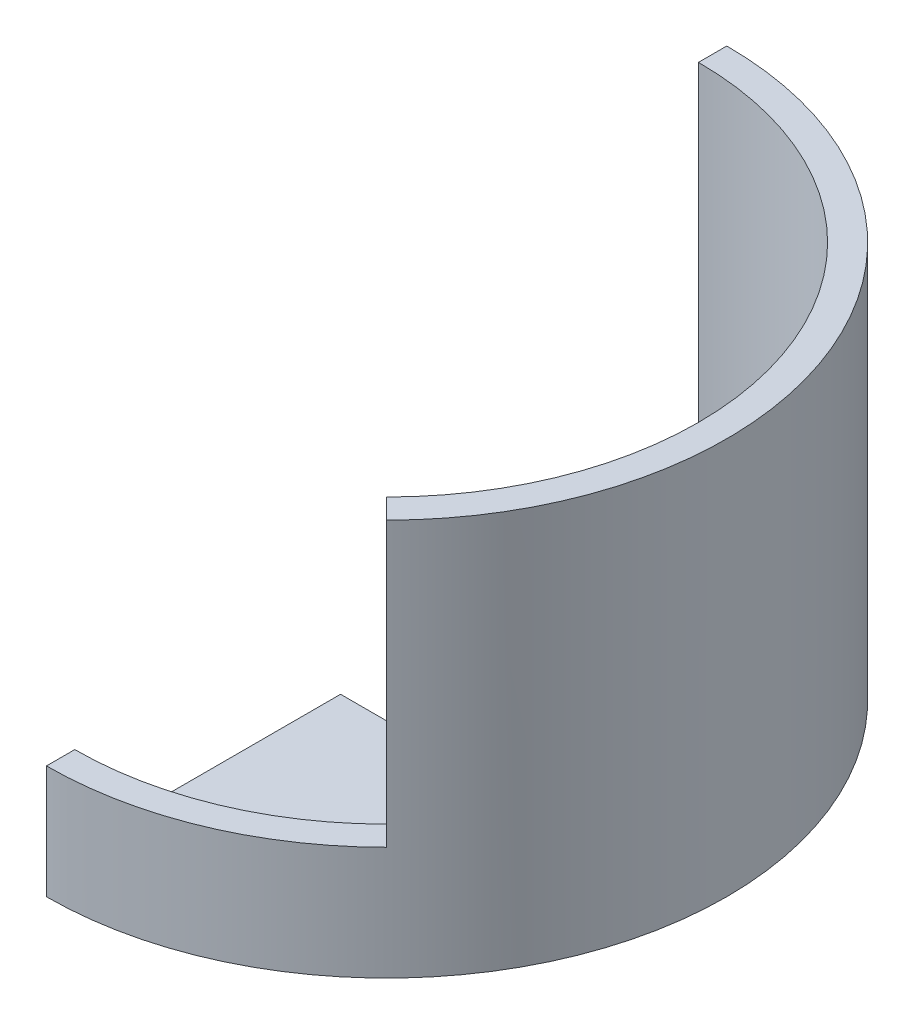
ISO-10303-21;
HEADER;
FILE_DESCRIPTION(('STEP AP214'),'2;1');
FILE_NAME('part.step','',(''),(''),'','','');
FILE_SCHEMA(('AUTOMOTIVE_DESIGN { 1 0 10303 214 1 1 1 1 }'));
ENDSEC;
DATA;
#1=APPLICATION_CONTEXT('core data for automotive mechanical design processes');
#2=APPLICATION_PROTOCOL_DEFINITION('international standard','automotive_design',2000,#1);
#3=PRODUCT_CONTEXT('',#1,'mechanical');
#4=PRODUCT('Part','Part','',(#3));
#5=PRODUCT_RELATED_PRODUCT_CATEGORY('part','',(#4));
#6=PRODUCT_DEFINITION_FORMATION('','',#4);
#7=PRODUCT_DEFINITION_CONTEXT('part definition',#1,'design');
#8=PRODUCT_DEFINITION('design','',#6,#7);
#9=PRODUCT_DEFINITION_SHAPE('','',#8);
#10=(LENGTH_UNIT() NAMED_UNIT(*) SI_UNIT(.MILLI.,.METRE.));
#11=(NAMED_UNIT(*) PLANE_ANGLE_UNIT() SI_UNIT($,.RADIAN.));
#12=(NAMED_UNIT(*) SI_UNIT($,.STERADIAN.) SOLID_ANGLE_UNIT());
#13=UNCERTAINTY_MEASURE_WITH_UNIT(LENGTH_MEASURE(1.E-05),#10,'distance_accuracy_value','');
#14=(GEOMETRIC_REPRESENTATION_CONTEXT(3) GLOBAL_UNCERTAINTY_ASSIGNED_CONTEXT((#13)) GLOBAL_UNIT_ASSIGNED_CONTEXT((#10,
#11,#12)) REPRESENTATION_CONTEXT('',''));
#15=CARTESIAN_POINT('',(0.,0.,0.));
#16=DIRECTION('',(0.,0.,1.));
#17=DIRECTION('',(1.,0.,0.));
#18=AXIS2_PLACEMENT_3D('',#15,#16,#17);
#19=CARTESIAN_POINT('',(0.,0.,0.));
#20=DIRECTION('',(1.,0.,0.));
#21=DIRECTION('',(0.,0.,-1.));
#22=AXIS2_PLACEMENT_3D('',#19,#20,#21);
#23=PLANE('',#22);
#24=DIRECTION('',(0.,0.,-1.));
#25=VECTOR('',#24,1.);
#26=CARTESIAN_POINT('',(0.,0.,0.));
#27=LINE('',#26,#25);
#28=CARTESIAN_POINT('',(0.,0.,-20.6375));
#29=VERTEX_POINT('',#28);
#30=CARTESIAN_POINT('',(0.,0.,-139.7));
#31=VERTEX_POINT('',#30);
#32=EDGE_CURVE('E146',#29,#31,#27,.T.);
#33=ORIENTED_EDGE('',*,*,#32,.F.);
#34=DIRECTION('',(0.,-1.,0.));
#35=VECTOR('',#34,1.);
#36=CARTESIAN_POINT('',(0.,12.7,-20.6375));
#37=LINE('',#36,#35);
#38=CARTESIAN_POINT('',(0.,12.7,-20.6375));
#39=VERTEX_POINT('',#38);
#40=EDGE_CURVE('E142',#39,#29,#37,.T.);
#41=ORIENTED_EDGE('',*,*,#40,.F.);
#42=DIRECTION('',(0.,0.,-1.));
#43=VECTOR('',#42,1.);
#44=CARTESIAN_POINT('',(0.,12.7,0.));
#45=LINE('',#44,#43);
#46=CARTESIAN_POINT('',(0.,12.7,-139.7));
#47=VERTEX_POINT('',#46);
#48=EDGE_CURVE('E62',#39,#47,#45,.T.);
#49=ORIENTED_EDGE('',*,*,#48,.T.);
#50=DIRECTION('',(0.,-1.,0.));
#51=VECTOR('',#50,1.);
#52=CARTESIAN_POINT('',(0.,12.7,-139.7));
#53=LINE('',#52,#51);
#54=EDGE_CURVE('E57',#31,#47,#53,.F.);
#55=ORIENTED_EDGE('',*,*,#54,.F.);
#56=EDGE_LOOP('',(#33,#41,#49,#55));
#57=FACE_BOUND('',#56,.T.);
#58=ADVANCED_FACE('F54',(#57),#23,.F.);
#59=CARTESIAN_POINT('',(0.,12.7,139.7));
#60=VERTEX_POINT('',#59);
#61=CARTESIAN_POINT('',(0.,12.7,20.6375));
#62=VERTEX_POINT('',#61);
#63=EDGE_CURVE('E148',#60,#62,#45,.T.);
#64=ORIENTED_EDGE('',*,*,#63,.T.);
#65=DIRECTION('',(0.,-1.,0.));
#66=VECTOR('',#65,1.);
#67=CARTESIAN_POINT('',(0.,12.7,20.6375));
#68=LINE('',#67,#66);
#69=CARTESIAN_POINT('',(0.,0.,20.6375));
#70=VERTEX_POINT('',#69);
#71=EDGE_CURVE('E12',#62,#70,#68,.T.);
#72=ORIENTED_EDGE('',*,*,#71,.T.);
#73=CARTESIAN_POINT('',(0.,0.,139.7));
#74=VERTEX_POINT('',#73);
#75=EDGE_CURVE('E70',#74,#70,#27,.T.);
#76=ORIENTED_EDGE('',*,*,#75,.F.);
#77=DIRECTION('',(0.,-1.,0.));
#78=VECTOR('',#77,1.);
#79=CARTESIAN_POINT('',(0.,12.7,139.7));
#80=LINE('',#79,#78);
#81=EDGE_CURVE('E149',#60,#74,#80,.T.);
#82=ORIENTED_EDGE('',*,*,#81,.F.);
#83=EDGE_LOOP('',(#64,#72,#76,#82));
#84=FACE_BOUND('',#83,.T.);
#85=ADVANCED_FACE('F158',(#84),#23,.F.);
#86=CARTESIAN_POINT('',(0.,12.7,0.));
#87=DIRECTION('',(0.,-1.,0.));
#88=DIRECTION('',(0.,0.,-1.));
#89=AXIS2_PLACEMENT_3D('',#86,#87,#88);
#90=CYLINDRICAL_SURFACE('',#89,139.7);
#91=CARTESIAN_POINT('',(0.,12.7,0.));
#92=DIRECTION('',(0.,1.,0.));
#93=DIRECTION('',(0.,0.,1.));
#94=AXIS2_PLACEMENT_3D('',#91,#92,#93);
#95=CIRCLE('',#94,139.7);
#96=EDGE_CURVE('E140',#60,#47,#95,.T.);
#97=ORIENTED_EDGE('',*,*,#96,.F.);
#98=ORIENTED_EDGE('',*,*,#81,.T.);
#99=CARTESIAN_POINT('',(0.,0.,0.));
#100=DIRECTION('',(0.,1.,0.));
#101=DIRECTION('',(0.,0.,1.));
#102=AXIS2_PLACEMENT_3D('',#99,#100,#101);
#103=CIRCLE('',#102,139.7);
#104=EDGE_CURVE('E135',#74,#31,#103,.T.);
#105=ORIENTED_EDGE('',*,*,#104,.T.);
#106=ORIENTED_EDGE('',*,*,#54,.T.);
#107=EDGE_LOOP('',(#97,#98,#105,#106));
#108=FACE_BOUND('',#107,.T.);
#109=ADVANCED_FACE('F156',(#108),#90,.T.);
#110=CARTESIAN_POINT('',(0.,12.7,0.));
#111=DIRECTION('',(0.,1.,0.));
#112=DIRECTION('',(0.,0.,1.));
#113=AXIS2_PLACEMENT_3D('',#110,#111,#112);
#114=PLANE('',#113);
#115=ORIENTED_EDGE('',*,*,#63,.F.);
#116=ORIENTED_EDGE('',*,*,#96,.T.);
#117=ORIENTED_EDGE('',*,*,#48,.F.);
#118=DIRECTION('',(1.,0.,0.));
#119=VECTOR('',#118,1.);
#120=CARTESIAN_POINT('',(-20.6375,12.7,-20.6375));
#121=LINE('',#120,#119);
#122=CARTESIAN_POINT('',(20.6375,12.7,-20.6375));
#123=VERTEX_POINT('',#122);
#124=EDGE_CURVE('E107',#39,#123,#121,.T.);
#125=ORIENTED_EDGE('',*,*,#124,.T.);
#126=DIRECTION('',(0.,0.,-1.));
#127=VECTOR('',#126,1.);
#128=CARTESIAN_POINT('',(20.6375,12.7,20.6375));
#129=LINE('',#128,#127);
#130=CARTESIAN_POINT('',(20.6375,12.7,20.6375));
#131=VERTEX_POINT('',#130);
#132=EDGE_CURVE('E112',#131,#123,#129,.T.);
#133=ORIENTED_EDGE('',*,*,#132,.F.);
#134=DIRECTION('',(1.,0.,0.));
#135=VECTOR('',#134,1.);
#136=CARTESIAN_POINT('',(-20.6375,12.7,20.6375));
#137=LINE('',#136,#135);
#138=EDGE_CURVE('E129',#62,#131,#137,.T.);
#139=ORIENTED_EDGE('',*,*,#138,.F.);
#140=EDGE_LOOP('',(#115,#116,#117,#125,#133,#139));
#141=FACE_BOUND('',#140,.T.);
#142=ADVANCED_FACE('F110',(#141),#114,.T.);
#143=CARTESIAN_POINT('',(0.,0.,0.));
#144=DIRECTION('',(0.,1.,0.));
#145=DIRECTION('',(0.,0.,1.));
#146=AXIS2_PLACEMENT_3D('',#143,#144,#145);
#147=PLANE('',#146);
#148=ORIENTED_EDGE('',*,*,#104,.F.);
#149=ORIENTED_EDGE('',*,*,#75,.T.);
#150=DIRECTION('',(1.,0.,0.));
#151=VECTOR('',#150,1.);
#152=CARTESIAN_POINT('',(-20.6375,0.,20.6375));
#153=LINE('',#152,#151);
#154=CARTESIAN_POINT('',(20.6375,0.,20.6375));
#155=VERTEX_POINT('',#154);
#156=EDGE_CURVE('E118',#70,#155,#153,.T.);
#157=ORIENTED_EDGE('',*,*,#156,.T.);
#158=DIRECTION('',(0.,0.,-1.));
#159=VECTOR('',#158,1.);
#160=CARTESIAN_POINT('',(20.6375,0.,20.6375));
#161=LINE('',#160,#159);
#162=CARTESIAN_POINT('',(20.6375,0.,-20.6375));
#163=VERTEX_POINT('',#162);
#164=EDGE_CURVE('E160',#155,#163,#161,.T.);
#165=ORIENTED_EDGE('',*,*,#164,.T.);
#166=DIRECTION('',(1.,0.,0.));
#167=VECTOR('',#166,1.);
#168=CARTESIAN_POINT('',(-20.6375,0.,-20.6375));
#169=LINE('',#168,#167);
#170=EDGE_CURVE('E133',#29,#163,#169,.T.);
#171=ORIENTED_EDGE('',*,*,#170,.F.);
#172=ORIENTED_EDGE('',*,*,#32,.T.);
#173=EDGE_LOOP('',(#148,#149,#157,#165,#171,#172));
#174=FACE_BOUND('',#173,.T.);
#175=ADVANCED_FACE('F152',(#174),#147,.F.);
#176=CARTESIAN_POINT('',(-20.6375,12.7,-20.6375));
#177=DIRECTION('',(0.,0.,-1.));
#178=DIRECTION('',(-1.,0.,0.));
#179=AXIS2_PLACEMENT_3D('',#176,#177,#178);
#180=PLANE('',#179);
#181=ORIENTED_EDGE('',*,*,#124,.F.);
#182=ORIENTED_EDGE('',*,*,#40,.T.);
#183=ORIENTED_EDGE('',*,*,#170,.T.);
#184=DIRECTION('',(0.,-1.,0.));
#185=VECTOR('',#184,1.);
#186=CARTESIAN_POINT('',(20.6375,12.7,-20.6375));
#187=LINE('',#186,#185);
#188=EDGE_CURVE('E125',#123,#163,#187,.T.);
#189=ORIENTED_EDGE('',*,*,#188,.F.);
#190=EDGE_LOOP('',(#181,#182,#183,#189));
#191=FACE_BOUND('',#190,.T.);
#192=ADVANCED_FACE('F131',(#191),#180,.F.);
#193=CARTESIAN_POINT('',(-20.6375,12.7,20.6375));
#194=DIRECTION('',(0.,0.,-1.));
#195=DIRECTION('',(-1.,0.,0.));
#196=AXIS2_PLACEMENT_3D('',#193,#194,#195);
#197=PLANE('',#196);
#198=ORIENTED_EDGE('',*,*,#71,.F.);
#199=ORIENTED_EDGE('',*,*,#138,.T.);
#200=DIRECTION('',(0.,-1.,0.));
#201=VECTOR('',#200,1.);
#202=CARTESIAN_POINT('',(20.6375,12.7,20.6375));
#203=LINE('',#202,#201);
#204=EDGE_CURVE('E128',#131,#155,#203,.T.);
#205=ORIENTED_EDGE('',*,*,#204,.T.);
#206=ORIENTED_EDGE('',*,*,#156,.F.);
#207=EDGE_LOOP('',(#198,#199,#205,#206));
#208=FACE_BOUND('',#207,.T.);
#209=ADVANCED_FACE('F159',(#208),#197,.T.);
#210=CARTESIAN_POINT('',(20.6375,12.7,20.6375));
#211=DIRECTION('',(-1.,0.,0.));
#212=DIRECTION('',(0.,0.,1.));
#213=AXIS2_PLACEMENT_3D('',#210,#211,#212);
#214=PLANE('',#213);
#215=ORIENTED_EDGE('',*,*,#164,.F.);
#216=ORIENTED_EDGE('',*,*,#204,.F.);
#217=ORIENTED_EDGE('',*,*,#132,.T.);
#218=ORIENTED_EDGE('',*,*,#188,.T.);
#219=EDGE_LOOP('',(#215,#216,#217,#218));
#220=FACE_BOUND('',#219,.T.);
#221=ADVANCED_FACE('F124',(#220),#214,.T.);
#222=CLOSED_SHELL('',(#58,#85,#109,#142,#175,#192,#209,#221));
#223=MANIFOLD_SOLID_BREP('B2',#222);
#224=CARTESIAN_POINT('',(0.,0.,0.));
#225=DIRECTION('',(1.,0.,0.));
#226=DIRECTION('',(0.,0.,-1.));
#227=AXIS2_PLACEMENT_3D('',#224,#225,#226);
#228=PLANE('',#227);
#229=DIRECTION('',(0.,0.,-1.));
#230=VECTOR('',#229,1.);
#231=CARTESIAN_POINT('',(0.,0.,107.830177644923));
#232=LINE('',#231,#230);
#233=CARTESIAN_POINT('',(0.,0.,152.494899658551));
#234=VERTEX_POINT('',#233);
#235=CARTESIAN_POINT('',(0.,0.,139.794899658551));
#236=VERTEX_POINT('',#235);
#237=EDGE_CURVE('E333',#234,#236,#232,.T.);
#238=ORIENTED_EDGE('',*,*,#237,.F.);
#239=DIRECTION('',(0.,-1.,0.));
#240=VECTOR('',#239,1.);
#241=CARTESIAN_POINT('',(0.,0.,152.494899658551));
#242=LINE('',#241,#240);
#243=CARTESIAN_POINT('',(0.,50.8,152.494899658551));
#244=VERTEX_POINT('',#243);
#245=EDGE_CURVE('E332',#234,#244,#242,.F.);
#246=ORIENTED_EDGE('',*,*,#245,.T.);
#247=DIRECTION('',(0.,0.,-1.));
#248=VECTOR('',#247,1.);
#249=CARTESIAN_POINT('',(0.,50.8,107.830177644923));
#250=LINE('',#249,#248);
#251=CARTESIAN_POINT('',(0.,50.8,139.794899658551));
#252=VERTEX_POINT('',#251);
#253=EDGE_CURVE('E235',#244,#252,#250,.T.);
#254=ORIENTED_EDGE('',*,*,#253,.T.);
#255=DIRECTION('',(0.,-1.,0.));
#256=VECTOR('',#255,1.);
#257=CARTESIAN_POINT('',(0.,0.,139.794899658551));
#258=LINE('',#257,#256);
#259=EDGE_CURVE('E229',#236,#252,#258,.F.);
#260=ORIENTED_EDGE('',*,*,#259,.F.);
#261=EDGE_LOOP('',(#238,#246,#254,#260));
#262=FACE_BOUND('',#261,.T.);
#263=ADVANCED_FACE('F226',(#262),#228,.F.);
#264=DIRECTION('',(0.,0.,-1.));
#265=VECTOR('',#264,1.);
#266=CARTESIAN_POINT('',(0.,177.8,107.830177644925));
#267=LINE('',#266,#265);
#268=CARTESIAN_POINT('',(0.,177.8,-139.794899658551));
#269=VERTEX_POINT('',#268);
#270=CARTESIAN_POINT('',(0.,177.8,-152.494899658551));
#271=VERTEX_POINT('',#270);
#272=EDGE_CURVE('E52',#269,#271,#267,.T.);
#273=ORIENTED_EDGE('',*,*,#272,.T.);
#274=DIRECTION('',(0.,-1.,0.));
#275=VECTOR('',#274,1.);
#276=CARTESIAN_POINT('',(0.,0.,-152.494899658551));
#277=LINE('',#276,#275);
#278=CARTESIAN_POINT('',(0.,0.,-152.494899658551));
#279=VERTEX_POINT('',#278);
#280=EDGE_CURVE('E243',#271,#279,#277,.T.);
#281=ORIENTED_EDGE('',*,*,#280,.T.);
#282=CARTESIAN_POINT('',(0.,0.,-139.794899658551));
#283=VERTEX_POINT('',#282);
#284=EDGE_CURVE('E328',#283,#279,#232,.T.);
#285=ORIENTED_EDGE('',*,*,#284,.F.);
#286=DIRECTION('',(0.,-1.,0.));
#287=VECTOR('',#286,1.);
#288=CARTESIAN_POINT('',(0.,0.,-139.794899658551));
#289=LINE('',#288,#287);
#290=EDGE_CURVE('E249',#269,#283,#289,.T.);
#291=ORIENTED_EDGE('',*,*,#290,.F.);
#292=EDGE_LOOP('',(#273,#281,#285,#291));
#293=FACE_BOUND('',#292,.T.);
#294=ADVANCED_FACE('F353',(#293),#228,.F.);
#295=CARTESIAN_POINT('',(0.,0.,0.));
#296=DIRECTION('',(0.,-1.,0.));
#297=DIRECTION('',(0.,0.,-1.));
#298=AXIS2_PLACEMENT_3D('',#295,#296,#297);
#299=CYLINDRICAL_SURFACE('',#298,139.794899658551);
#300=CARTESIAN_POINT('',(0.,0.,0.));
#301=DIRECTION('',(0.,-1.,0.));
#302=DIRECTION('',(0.,0.,-1.));
#303=AXIS2_PLACEMENT_3D('',#300,#301,#302);
#304=CIRCLE('',#303,139.794899658551);
#305=EDGE_CURVE('E326',#283,#236,#304,.T.);
#306=ORIENTED_EDGE('',*,*,#305,.T.);
#307=ORIENTED_EDGE('',*,*,#259,.T.);
#308=CARTESIAN_POINT('',(0.,50.8,0.));
#309=DIRECTION('',(0.,-1.,0.));
#310=DIRECTION('',(0.,0.,-1.));
#311=AXIS2_PLACEMENT_3D('',#308,#309,#310);
#312=CIRCLE('',#311,139.794899658551);
#313=CARTESIAN_POINT('',(98.8499215238542,50.8,98.8499215238541));
#314=VERTEX_POINT('',#313);
#315=EDGE_CURVE('E297',#314,#252,#312,.T.);
#316=ORIENTED_EDGE('',*,*,#315,.F.);
#317=DIRECTION('',(0.,1.,0.));
#318=VECTOR('',#317,1.);
#319=CARTESIAN_POINT('',(98.8499215238542,0.,98.8499215238542));
#320=LINE('',#319,#318);
#321=CARTESIAN_POINT('',(98.8499215238541,177.8,98.8499215238542));
#322=VERTEX_POINT('',#321);
#323=EDGE_CURVE('E293',#314,#322,#320,.T.);
#324=ORIENTED_EDGE('',*,*,#323,.T.);
#325=CARTESIAN_POINT('',(0.,177.8,0.));
#326=DIRECTION('',(0.,-1.,0.));
#327=DIRECTION('',(0.,0.,-1.));
#328=AXIS2_PLACEMENT_3D('',#325,#326,#327);
#329=CIRCLE('',#328,139.794899658551);
#330=EDGE_CURVE('E281',#269,#322,#329,.T.);
#331=ORIENTED_EDGE('',*,*,#330,.F.);
#332=ORIENTED_EDGE('',*,*,#290,.T.);
#333=EDGE_LOOP('',(#306,#307,#316,#324,#331,#332));
#334=FACE_BOUND('',#333,.T.);
#335=ADVANCED_FACE('F295',(#334),#299,.F.);
#336=CARTESIAN_POINT('',(107.830177644923,0.,107.830177644923));
#337=DIRECTION('',(0.,1.,0.));
#338=DIRECTION('',(0.,0.,1.));
#339=AXIS2_PLACEMENT_3D('',#336,#337,#338);
#340=PLANE('',#339);
#341=CARTESIAN_POINT('',(0.,0.,0.));
#342=DIRECTION('',(0.,-1.,0.));
#343=DIRECTION('',(0.,0.,-1.));
#344=AXIS2_PLACEMENT_3D('',#341,#342,#343);
#345=CIRCLE('',#344,152.494899658551);
#346=EDGE_CURVE('E322',#279,#234,#345,.T.);
#347=ORIENTED_EDGE('',*,*,#346,.T.);
#348=ORIENTED_EDGE('',*,*,#237,.T.);
#349=ORIENTED_EDGE('',*,*,#305,.F.);
#350=ORIENTED_EDGE('',*,*,#284,.T.);
#351=EDGE_LOOP('',(#347,#348,#349,#350));
#352=FACE_BOUND('',#351,.T.);
#353=ADVANCED_FACE('F351',(#352),#340,.F.);
#354=CARTESIAN_POINT('',(0.,0.,0.));
#355=DIRECTION('',(0.,-1.,0.));
#356=DIRECTION('',(0.,0.,-1.));
#357=AXIS2_PLACEMENT_3D('',#354,#355,#356);
#358=CYLINDRICAL_SURFACE('',#357,152.494899658551);
#359=ORIENTED_EDGE('',*,*,#245,.F.);
#360=ORIENTED_EDGE('',*,*,#346,.F.);
#361=ORIENTED_EDGE('',*,*,#280,.F.);
#362=CARTESIAN_POINT('',(0.,177.8,0.));
#363=DIRECTION('',(0.,-1.,0.));
#364=DIRECTION('',(0.,0.,-1.));
#365=AXIS2_PLACEMENT_3D('',#362,#363,#364);
#366=CIRCLE('',#365,152.494899658551);
#367=CARTESIAN_POINT('',(107.830177644923,177.8,107.830177644923));
#368=VERTEX_POINT('',#367);
#369=EDGE_CURVE('E290',#271,#368,#366,.T.);
#370=ORIENTED_EDGE('',*,*,#369,.T.);
#371=DIRECTION('',(0.,1.,0.));
#372=VECTOR('',#371,1.);
#373=CARTESIAN_POINT('',(107.830177644923,0.,107.830177644923));
#374=LINE('',#373,#372);
#375=CARTESIAN_POINT('',(107.830177644923,50.8,107.830177644923));
#376=VERTEX_POINT('',#375);
#377=EDGE_CURVE('E306',#376,#368,#374,.T.);
#378=ORIENTED_EDGE('',*,*,#377,.F.);
#379=CARTESIAN_POINT('',(0.,50.8,0.));
#380=DIRECTION('',(0.,-1.,0.));
#381=DIRECTION('',(0.,0.,-1.));
#382=AXIS2_PLACEMENT_3D('',#379,#380,#381);
#383=CIRCLE('',#382,152.494899658551);
#384=EDGE_CURVE('E318',#376,#244,#383,.T.);
#385=ORIENTED_EDGE('',*,*,#384,.T.);
#386=EDGE_LOOP('',(#359,#360,#361,#370,#378,#385));
#387=FACE_BOUND('',#386,.T.);
#388=ADVANCED_FACE('F349',(#387),#358,.T.);
#389=CARTESIAN_POINT('',(107.830177644923,50.8,107.830177644923));
#390=DIRECTION('',(0.,1.,0.));
#391=DIRECTION('',(0.,0.,1.));
#392=AXIS2_PLACEMENT_3D('',#389,#390,#391);
#393=PLANE('',#392);
#394=ORIENTED_EDGE('',*,*,#253,.F.);
#395=ORIENTED_EDGE('',*,*,#384,.F.);
#396=DIRECTION('',(-0.707106781186548,0.,-0.707106781186548));
#397=VECTOR('',#396,1.);
#398=CARTESIAN_POINT('',(107.830177644923,50.8,107.830177644923));
#399=LINE('',#398,#397);
#400=EDGE_CURVE('E289',#376,#314,#399,.T.);
#401=ORIENTED_EDGE('',*,*,#400,.T.);
#402=ORIENTED_EDGE('',*,*,#315,.T.);
#403=EDGE_LOOP('',(#394,#395,#401,#402));
#404=FACE_BOUND('',#403,.T.);
#405=ADVANCED_FACE('F348',(#404),#393,.T.);
#406=CARTESIAN_POINT('',(-107.830177644922,177.8,107.830177644925));
#407=DIRECTION('',(0.,1.,0.));
#408=DIRECTION('',(0.,0.,1.));
#409=AXIS2_PLACEMENT_3D('',#406,#407,#408);
#410=PLANE('',#409);
#411=ORIENTED_EDGE('',*,*,#272,.F.);
#412=ORIENTED_EDGE('',*,*,#330,.T.);
#413=DIRECTION('',(-0.707106781186548,0.,-0.707106781186548));
#414=VECTOR('',#413,1.);
#415=CARTESIAN_POINT('',(107.830177644923,177.8,107.830177644923));
#416=LINE('',#415,#414);
#417=EDGE_CURVE('E286',#368,#322,#416,.T.);
#418=ORIENTED_EDGE('',*,*,#417,.F.);
#419=ORIENTED_EDGE('',*,*,#369,.F.);
#420=EDGE_LOOP('',(#411,#412,#418,#419));
#421=FACE_BOUND('',#420,.T.);
#422=ADVANCED_FACE('F283',(#421),#410,.T.);
#423=CARTESIAN_POINT('',(0.,0.,0.));
#424=DIRECTION('',(-0.707106781186548,0.,0.707106781186548));
#425=DIRECTION('',(0.707106781186548,0.,0.707106781186548));
#426=AXIS2_PLACEMENT_3D('',#423,#424,#425);
#427=PLANE('',#426);
#428=ORIENTED_EDGE('',*,*,#323,.F.);
#429=ORIENTED_EDGE('',*,*,#400,.F.);
#430=ORIENTED_EDGE('',*,*,#377,.T.);
#431=ORIENTED_EDGE('',*,*,#417,.T.);
#432=EDGE_LOOP('',(#428,#429,#430,#431));
#433=FACE_BOUND('',#432,.T.);
#434=ADVANCED_FACE('F304',(#433),#427,.T.);
#435=CLOSED_SHELL('',(#263,#294,#335,#353,#388,#405,#422,#434));
#436=MANIFOLD_SOLID_BREP('B6',#435);
#437=ADVANCED_BREP_SHAPE_REPRESENTATION('',(#18,#223,#436),#14);
#438=SHAPE_DEFINITION_REPRESENTATION(#9,#437);
ENDSEC;
END-ISO-10303-21;
